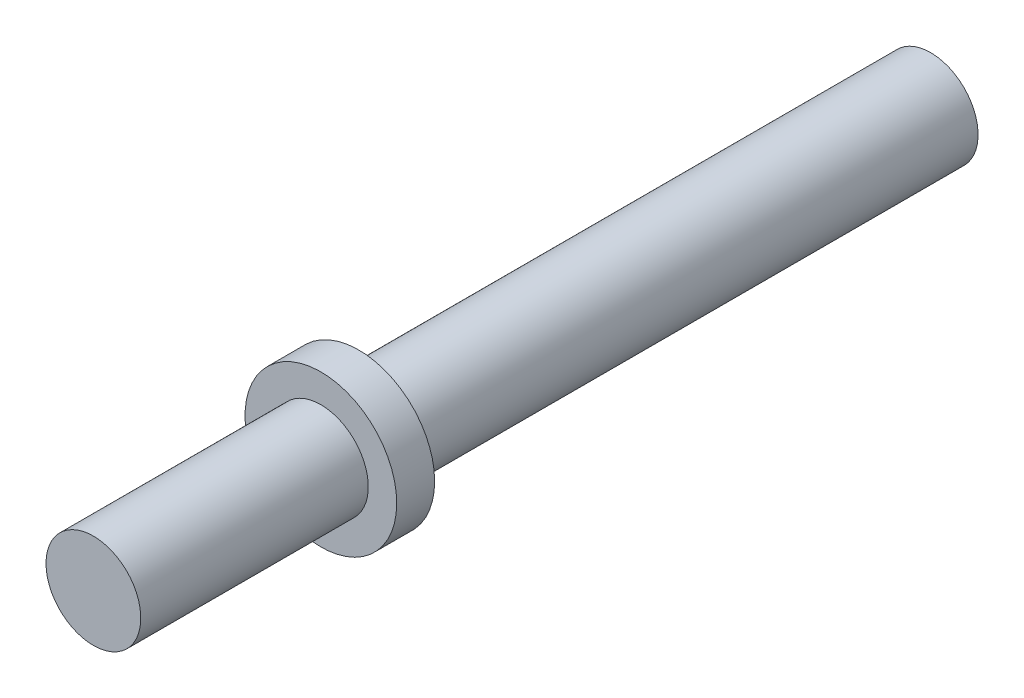
ISO-10303-21;
HEADER;
FILE_DESCRIPTION(('STEP AP214'),'2;1');
FILE_NAME('part.step','',(''),(''),'','','');
FILE_SCHEMA(('AUTOMOTIVE_DESIGN { 1 0 10303 214 1 1 1 1 }'));
ENDSEC;
DATA;
#1=APPLICATION_CONTEXT('core data for automotive mechanical design processes');
#2=APPLICATION_PROTOCOL_DEFINITION('international standard','automotive_design',2000,#1);
#3=PRODUCT_CONTEXT('',#1,'mechanical');
#4=PRODUCT('Part','Part','',(#3));
#5=PRODUCT_RELATED_PRODUCT_CATEGORY('part','',(#4));
#6=PRODUCT_DEFINITION_FORMATION('','',#4);
#7=PRODUCT_DEFINITION_CONTEXT('part definition',#1,'design');
#8=PRODUCT_DEFINITION('design','',#6,#7);
#9=PRODUCT_DEFINITION_SHAPE('','',#8);
#10=(LENGTH_UNIT() NAMED_UNIT(*) SI_UNIT(.MILLI.,.METRE.));
#11=(NAMED_UNIT(*) PLANE_ANGLE_UNIT() SI_UNIT($,.RADIAN.));
#12=(NAMED_UNIT(*) SI_UNIT($,.STERADIAN.) SOLID_ANGLE_UNIT());
#13=UNCERTAINTY_MEASURE_WITH_UNIT(LENGTH_MEASURE(1.E-05),#10,'distance_accuracy_value','');
#14=(GEOMETRIC_REPRESENTATION_CONTEXT(3) GLOBAL_UNCERTAINTY_ASSIGNED_CONTEXT((#13)) GLOBAL_UNIT_ASSIGNED_CONTEXT((#10,
#11,#12)) REPRESENTATION_CONTEXT('',''));
#15=CARTESIAN_POINT('',(0.,0.,0.));
#16=DIRECTION('',(0.,0.,1.));
#17=DIRECTION('',(1.,0.,0.));
#18=AXIS2_PLACEMENT_3D('',#15,#16,#17);
#19=CARTESIAN_POINT('',(-32.018684277368,-34.6434023405005,44.));
#20=DIRECTION('',(0.,0.,-1.));
#21=DIRECTION('',(-1.,0.,0.));
#22=AXIS2_PLACEMENT_3D('',#19,#20,#21);
#23=CYLINDRICAL_SURFACE('',#22,1.5);
#24=CARTESIAN_POINT('',(-32.018684277368,-34.6434023405005,36.8));
#25=DIRECTION('',(0.,0.,1.));
#26=DIRECTION('',(1.,0.,0.));
#27=AXIS2_PLACEMENT_3D('',#24,#25,#26);
#28=CIRCLE('',#27,1.5);
#29=CARTESIAN_POINT('',(-33.518684277368,-34.6434023405005,36.8));
#30=VERTEX_POINT('',#29);
#31=EDGE_CURVE('E42',#30,#30,#28,.T.);
#32=CARTESIAN_POINT('',(-32.018684277368,-34.6434023405005,44.));
#33=DIRECTION('',(0.,0.,1.));
#34=DIRECTION('',(1.,0.,0.));
#35=AXIS2_PLACEMENT_3D('',#32,#33,#34);
#36=CIRCLE('',#35,1.5);
#37=CARTESIAN_POINT('',(-33.518684277368,-34.6434023405005,44.));
#38=VERTEX_POINT('',#37);
#39=EDGE_CURVE('E46',#38,#38,#36,.T.);
#40=CARTESIAN_POINT('',(-33.518684277368,-34.6434023405005,36.8));
#41=CARTESIAN_POINT('',(-33.518684277368,-34.6434023405005,36.875));
#42=CARTESIAN_POINT('',(-33.518684277368,-34.6434023405005,36.95));
#43=CARTESIAN_POINT('',(-33.518684277368,-34.6434023405005,37.1));
#44=CARTESIAN_POINT('',(-33.518684277368,-34.6434023405005,37.175));
#45=CARTESIAN_POINT('',(-33.518684277368,-34.6434023405005,37.325));
#46=CARTESIAN_POINT('',(-33.518684277368,-34.6434023405005,37.4));
#47=CARTESIAN_POINT('',(-33.518684277368,-34.6434023405005,37.55));
#48=CARTESIAN_POINT('',(-33.518684277368,-34.6434023405005,37.625));
#49=CARTESIAN_POINT('',(-33.518684277368,-34.6434023405005,37.775));
#50=CARTESIAN_POINT('',(-33.518684277368,-34.6434023405005,37.85));
#51=CARTESIAN_POINT('',(-33.518684277368,-34.6434023405005,38.));
#52=CARTESIAN_POINT('',(-33.518684277368,-34.6434023405005,38.075));
#53=CARTESIAN_POINT('',(-33.518684277368,-34.6434023405005,38.225));
#54=CARTESIAN_POINT('',(-33.518684277368,-34.6434023405005,38.3));
#55=CARTESIAN_POINT('',(-33.518684277368,-34.6434023405005,38.45));
#56=CARTESIAN_POINT('',(-33.518684277368,-34.6434023405005,38.525));
#57=CARTESIAN_POINT('',(-33.518684277368,-34.6434023405005,38.675));
#58=CARTESIAN_POINT('',(-33.518684277368,-34.6434023405005,38.75));
#59=CARTESIAN_POINT('',(-33.518684277368,-34.6434023405005,38.9));
#60=CARTESIAN_POINT('',(-33.518684277368,-34.6434023405005,38.975));
#61=CARTESIAN_POINT('',(-33.518684277368,-34.6434023405005,39.125));
#62=CARTESIAN_POINT('',(-33.518684277368,-34.6434023405005,39.2));
#63=CARTESIAN_POINT('',(-33.518684277368,-34.6434023405005,39.35));
#64=CARTESIAN_POINT('',(-33.518684277368,-34.6434023405005,39.425));
#65=CARTESIAN_POINT('',(-33.518684277368,-34.6434023405005,39.575));
#66=CARTESIAN_POINT('',(-33.518684277368,-34.6434023405005,39.65));
#67=CARTESIAN_POINT('',(-33.518684277368,-34.6434023405005,39.8));
#68=CARTESIAN_POINT('',(-33.518684277368,-34.6434023405005,39.875));
#69=CARTESIAN_POINT('',(-33.518684277368,-34.6434023405005,40.025));
#70=CARTESIAN_POINT('',(-33.518684277368,-34.6434023405005,40.1));
#71=CARTESIAN_POINT('',(-33.518684277368,-34.6434023405005,40.25));
#72=CARTESIAN_POINT('',(-33.518684277368,-34.6434023405005,40.325));
#73=CARTESIAN_POINT('',(-33.518684277368,-34.6434023405005,40.475));
#74=CARTESIAN_POINT('',(-33.518684277368,-34.6434023405005,40.55));
#75=CARTESIAN_POINT('',(-33.518684277368,-34.6434023405005,40.7));
#76=CARTESIAN_POINT('',(-33.518684277368,-34.6434023405005,40.775));
#77=CARTESIAN_POINT('',(-33.518684277368,-34.6434023405005,40.925));
#78=CARTESIAN_POINT('',(-33.518684277368,-34.6434023405005,41.));
#79=CARTESIAN_POINT('',(-33.518684277368,-34.6434023405005,41.15));
#80=CARTESIAN_POINT('',(-33.518684277368,-34.6434023405005,41.225));
#81=CARTESIAN_POINT('',(-33.518684277368,-34.6434023405005,41.375));
#82=CARTESIAN_POINT('',(-33.518684277368,-34.6434023405005,41.45));
#83=CARTESIAN_POINT('',(-33.518684277368,-34.6434023405005,41.6));
#84=CARTESIAN_POINT('',(-33.518684277368,-34.6434023405005,41.675));
#85=CARTESIAN_POINT('',(-33.518684277368,-34.6434023405005,41.825));
#86=CARTESIAN_POINT('',(-33.518684277368,-34.6434023405005,41.9));
#87=CARTESIAN_POINT('',(-33.518684277368,-34.6434023405005,42.05));
#88=CARTESIAN_POINT('',(-33.518684277368,-34.6434023405005,42.125));
#89=CARTESIAN_POINT('',(-33.518684277368,-34.6434023405005,42.275));
#90=CARTESIAN_POINT('',(-33.518684277368,-34.6434023405005,42.35));
#91=CARTESIAN_POINT('',(-33.518684277368,-34.6434023405005,42.5));
#92=CARTESIAN_POINT('',(-33.518684277368,-34.6434023405005,42.575));
#93=CARTESIAN_POINT('',(-33.518684277368,-34.6434023405005,42.725));
#94=CARTESIAN_POINT('',(-33.518684277368,-34.6434023405005,42.8));
#95=CARTESIAN_POINT('',(-33.518684277368,-34.6434023405005,42.95));
#96=CARTESIAN_POINT('',(-33.518684277368,-34.6434023405005,43.025));
#97=CARTESIAN_POINT('',(-33.518684277368,-34.6434023405005,43.175));
#98=CARTESIAN_POINT('',(-33.518684277368,-34.6434023405005,43.25));
#99=CARTESIAN_POINT('',(-33.518684277368,-34.6434023405005,43.4));
#100=CARTESIAN_POINT('',(-33.518684277368,-34.6434023405005,43.475));
#101=CARTESIAN_POINT('',(-33.518684277368,-34.6434023405005,43.625));
#102=CARTESIAN_POINT('',(-33.518684277368,-34.6434023405005,43.7));
#103=CARTESIAN_POINT('',(-33.518684277368,-34.6434023405005,43.85));
#104=CARTESIAN_POINT('',(-33.518684277368,-34.6434023405005,43.925));
#105=CARTESIAN_POINT('',(-33.518684277368,-34.6434023405005,44.));
#106=B_SPLINE_CURVE_WITH_KNOTS('',3,(#40,#41,#42,#43,#44,#45,#46,#47,#48,#49,#50,#51,#52,#53,
#54,#55,#56,#57,#58,#59,#60,#61,#62,#63,#64,#65,#66,#67,#68,#69,#70,#71,#72,#73,#74,#75,#76,#77,
#78,#79,#80,#81,#82,#83,#84,#85,#86,#87,#88,#89,#90,#91,#92,#93,#94,#95,#96,#97,#98,#99,#100,
#101,#102,#103,#104,#105),.UNSPECIFIED.,.F.,.F.,(4,2,2,2,2,2,2,2,2,2,2,2,2,2,2,2,2,2,2,2,2,2,2,
2,2,2,2,2,2,2,2,2,4),(0.,0.225000000000003,0.449999999999999,0.675000000000002,
0.900000000000005,1.125,1.35,1.575,1.8,2.02500000000001,2.25,2.475,2.7,2.925,3.15,3.375,3.6,
3.825,4.05000000000001,4.275,4.5,4.725,4.95,5.175,5.4,5.62500000000001,5.85,6.075,6.3,6.525,
6.75,6.975,7.2),.UNSPECIFIED.);
#107=EDGE_CURVE('BSEAM39',#30,#38,#106,.T.);
#108=ORIENTED_EDGE('',*,*,#31,.T.);
#109=ORIENTED_EDGE('',*,*,#39,.F.);
#110=ORIENTED_EDGE('',*,*,#107,.T.);
#111=ORIENTED_EDGE('',*,*,#107,.F.);
#112=EDGE_LOOP('',(#108,#110,#109,#111));
#113=FACE_BOUND('',#112,.T.);
#114=ADVANCED_FACE('F39',(#113),#23,.T.);
#115=CARTESIAN_POINT('',(-32.018684277368,-34.6434023405005,44.));
#116=DIRECTION('',(0.,0.,1.));
#117=DIRECTION('',(1.,0.,0.));
#118=AXIS2_PLACEMENT_3D('',#115,#116,#117);
#119=PLANE('',#118);
#120=ORIENTED_EDGE('',*,*,#39,.T.);
#121=EDGE_LOOP('',(#120));
#122=FACE_BOUND('',#121,.T.);
#123=ADVANCED_FACE('F78',(#122),#119,.T.);
#124=CARTESIAN_POINT('',(-32.018684277368,-34.6434023405005,36.8));
#125=DIRECTION('',(0.,0.,-1.));
#126=DIRECTION('',(-1.,0.,0.));
#127=AXIS2_PLACEMENT_3D('',#124,#125,#126);
#128=CYLINDRICAL_SURFACE('',#127,2.4);
#129=CARTESIAN_POINT('',(-32.018684277368,-34.6434023405005,36.8));
#130=DIRECTION('',(0.,0.,1.));
#131=DIRECTION('',(1.,0.,0.));
#132=AXIS2_PLACEMENT_3D('',#129,#130,#131);
#133=CIRCLE('',#132,2.4);
#134=CARTESIAN_POINT('',(-29.618684277368,-34.6434023405005,36.8));
#135=VERTEX_POINT('',#134);
#136=EDGE_CURVE('E58',#135,#135,#133,.T.);
#137=ORIENTED_EDGE('',*,*,#136,.F.);
#138=EDGE_LOOP('',(#137));
#139=FACE_BOUND('',#138,.T.);
#140=CARTESIAN_POINT('',(-32.018684277368,-34.6434023405005,35.6));
#141=DIRECTION('',(0.,0.,1.));
#142=DIRECTION('',(1.,0.,0.));
#143=AXIS2_PLACEMENT_3D('',#140,#141,#142);
#144=CIRCLE('',#143,2.4);
#145=CARTESIAN_POINT('',(-29.618684277368,-34.6434023405005,35.6));
#146=VERTEX_POINT('',#145);
#147=EDGE_CURVE('E55',#146,#146,#144,.T.);
#148=ORIENTED_EDGE('',*,*,#147,.T.);
#149=EDGE_LOOP('',(#148));
#150=FACE_BOUND('',#149,.T.);
#151=ADVANCED_FACE('F70',(#139,#150),#128,.T.);
#152=CARTESIAN_POINT('',(-32.018684277368,-34.6434023405005,36.8));
#153=DIRECTION('',(0.,0.,1.));
#154=DIRECTION('',(1.,0.,0.));
#155=AXIS2_PLACEMENT_3D('',#152,#153,#154);
#156=PLANE('',#155);
#157=ORIENTED_EDGE('',*,*,#31,.F.);
#158=EDGE_LOOP('',(#157));
#159=FACE_BOUND('',#158,.T.);
#160=ORIENTED_EDGE('',*,*,#136,.T.);
#161=EDGE_LOOP('',(#160));
#162=FACE_BOUND('',#161,.T.);
#163=ADVANCED_FACE('F67',(#159,#162),#156,.T.);
#164=CARTESIAN_POINT('',(-32.018684277368,-34.6434023405005,35.6));
#165=DIRECTION('',(0.,0.,1.));
#166=DIRECTION('',(1.,0.,0.));
#167=AXIS2_PLACEMENT_3D('',#164,#165,#166);
#168=PLANE('',#167);
#169=CARTESIAN_POINT('',(-32.018684277368,-34.6434023405005,35.6));
#170=DIRECTION('',(0.,0.,1.));
#171=DIRECTION('',(1.,0.,0.));
#172=AXIS2_PLACEMENT_3D('',#169,#170,#171);
#173=CIRCLE('',#172,1.5);
#174=CARTESIAN_POINT('',(-33.518684277368,-34.6434023405005,35.6));
#175=VERTEX_POINT('',#174);
#176=EDGE_CURVE('E10',#175,#175,#173,.T.);
#177=ORIENTED_EDGE('',*,*,#176,.T.);
#178=EDGE_LOOP('',(#177));
#179=FACE_BOUND('',#178,.T.);
#180=ORIENTED_EDGE('',*,*,#147,.F.);
#181=EDGE_LOOP('',(#180));
#182=FACE_BOUND('',#181,.T.);
#183=ADVANCED_FACE('F69',(#179,#182),#168,.F.);
#184=CARTESIAN_POINT('',(-32.018684277368,-34.6434023405005,17.500063));
#185=DIRECTION('',(0.,0.,1.));
#186=DIRECTION('',(1.,0.,0.));
#187=AXIS2_PLACEMENT_3D('',#184,#185,#186);
#188=PLANE('',#187);
#189=CARTESIAN_POINT('',(-32.018684277368,-34.6434023405005,17.500063));
#190=DIRECTION('',(0.,0.,1.));
#191=DIRECTION('',(1.,0.,0.));
#192=AXIS2_PLACEMENT_3D('',#189,#190,#191);
#193=CIRCLE('',#192,1.5);
#194=CARTESIAN_POINT('',(-33.518684277368,-34.6434023405005,17.500063));
#195=VERTEX_POINT('',#194);
#196=EDGE_CURVE('E50',#195,#195,#193,.T.);
#197=ORIENTED_EDGE('',*,*,#196,.F.);
#198=EDGE_LOOP('',(#197));
#199=FACE_BOUND('',#198,.T.);
#200=ADVANCED_FACE('F76',(#199),#188,.F.);
#201=CARTESIAN_POINT('',(-33.518684277368,-34.6434023405005,17.500063));
#202=CARTESIAN_POINT('',(-33.518684277368,-34.6434023405005,17.6886040104167));
#203=CARTESIAN_POINT('',(-33.518684277368,-34.6434023405005,17.8771450208333));
#204=CARTESIAN_POINT('',(-33.518684277368,-34.6434023405005,18.2542270416667));
#205=CARTESIAN_POINT('',(-33.518684277368,-34.6434023405005,18.4427680520833));
#206=CARTESIAN_POINT('',(-33.518684277368,-34.6434023405005,18.8198500729167));
#207=CARTESIAN_POINT('',(-33.518684277368,-34.6434023405005,19.0083910833333));
#208=CARTESIAN_POINT('',(-33.518684277368,-34.6434023405005,19.3854731041667));
#209=CARTESIAN_POINT('',(-33.518684277368,-34.6434023405005,19.5740141145833));
#210=CARTESIAN_POINT('',(-33.518684277368,-34.6434023405005,19.9510961354167));
#211=CARTESIAN_POINT('',(-33.518684277368,-34.6434023405005,20.1396371458333));
#212=CARTESIAN_POINT('',(-33.518684277368,-34.6434023405005,20.5167191666667));
#213=CARTESIAN_POINT('',(-33.518684277368,-34.6434023405005,20.7052601770833));
#214=CARTESIAN_POINT('',(-33.518684277368,-34.6434023405005,21.0823421979167));
#215=CARTESIAN_POINT('',(-33.518684277368,-34.6434023405005,21.2708832083333));
#216=CARTESIAN_POINT('',(-33.518684277368,-34.6434023405005,21.6479652291667));
#217=CARTESIAN_POINT('',(-33.518684277368,-34.6434023405005,21.8365062395833));
#218=CARTESIAN_POINT('',(-33.518684277368,-34.6434023405005,22.2135882604167));
#219=CARTESIAN_POINT('',(-33.518684277368,-34.6434023405005,22.4021292708333));
#220=CARTESIAN_POINT('',(-33.518684277368,-34.6434023405005,22.7792112916667));
#221=CARTESIAN_POINT('',(-33.518684277368,-34.6434023405005,22.9677523020833));
#222=CARTESIAN_POINT('',(-33.518684277368,-34.6434023405005,23.3448343229167));
#223=CARTESIAN_POINT('',(-33.518684277368,-34.6434023405005,23.5333753333333));
#224=CARTESIAN_POINT('',(-33.518684277368,-34.6434023405005,23.9104573541667));
#225=CARTESIAN_POINT('',(-33.518684277368,-34.6434023405005,24.0989983645833));
#226=CARTESIAN_POINT('',(-33.518684277368,-34.6434023405005,24.4760803854167));
#227=CARTESIAN_POINT('',(-33.518684277368,-34.6434023405005,24.6646213958333));
#228=CARTESIAN_POINT('',(-33.518684277368,-34.6434023405005,25.0417034166667));
#229=CARTESIAN_POINT('',(-33.518684277368,-34.6434023405005,25.2302444270833));
#230=CARTESIAN_POINT('',(-33.518684277368,-34.6434023405005,25.6073264479167));
#231=CARTESIAN_POINT('',(-33.518684277368,-34.6434023405005,25.7958674583333));
#232=CARTESIAN_POINT('',(-33.518684277368,-34.6434023405005,26.1729494791667));
#233=CARTESIAN_POINT('',(-33.518684277368,-34.6434023405005,26.3614904895833));
#234=CARTESIAN_POINT('',(-33.518684277368,-34.6434023405005,26.7385725104167));
#235=CARTESIAN_POINT('',(-33.518684277368,-34.6434023405005,26.9271135208333));
#236=CARTESIAN_POINT('',(-33.518684277368,-34.6434023405005,27.3041955416667));
#237=CARTESIAN_POINT('',(-33.518684277368,-34.6434023405005,27.4927365520833));
#238=CARTESIAN_POINT('',(-33.518684277368,-34.6434023405005,27.8698185729167));
#239=CARTESIAN_POINT('',(-33.518684277368,-34.6434023405005,28.0583595833333));
#240=CARTESIAN_POINT('',(-33.518684277368,-34.6434023405005,28.4354416041667));
#241=CARTESIAN_POINT('',(-33.518684277368,-34.6434023405005,28.6239826145833));
#242=CARTESIAN_POINT('',(-33.518684277368,-34.6434023405005,29.0010646354167));
#243=CARTESIAN_POINT('',(-33.518684277368,-34.6434023405005,29.1896056458333));
#244=CARTESIAN_POINT('',(-33.518684277368,-34.6434023405005,29.5666876666667));
#245=CARTESIAN_POINT('',(-33.518684277368,-34.6434023405005,29.7552286770833));
#246=CARTESIAN_POINT('',(-33.518684277368,-34.6434023405005,30.1323106979167));
#247=CARTESIAN_POINT('',(-33.518684277368,-34.6434023405005,30.3208517083333));
#248=CARTESIAN_POINT('',(-33.518684277368,-34.6434023405005,30.6979337291667));
#249=CARTESIAN_POINT('',(-33.518684277368,-34.6434023405005,30.8864747395833));
#250=CARTESIAN_POINT('',(-33.518684277368,-34.6434023405005,31.2635567604167));
#251=CARTESIAN_POINT('',(-33.518684277368,-34.6434023405005,31.4520977708333));
#252=CARTESIAN_POINT('',(-33.518684277368,-34.6434023405005,31.8291797916667));
#253=CARTESIAN_POINT('',(-33.518684277368,-34.6434023405005,32.0177208020833));
#254=CARTESIAN_POINT('',(-33.518684277368,-34.6434023405005,32.3948028229167));
#255=CARTESIAN_POINT('',(-33.518684277368,-34.6434023405005,32.5833438333333));
#256=CARTESIAN_POINT('',(-33.518684277368,-34.6434023405005,32.9604258541667));
#257=CARTESIAN_POINT('',(-33.518684277368,-34.6434023405005,33.1489668645833));
#258=CARTESIAN_POINT('',(-33.518684277368,-34.6434023405005,33.5260488854167));
#259=CARTESIAN_POINT('',(-33.518684277368,-34.6434023405005,33.7145898958333));
#260=CARTESIAN_POINT('',(-33.518684277368,-34.6434023405005,34.0916719166667));
#261=CARTESIAN_POINT('',(-33.518684277368,-34.6434023405005,34.2802129270833));
#262=CARTESIAN_POINT('',(-33.518684277368,-34.6434023405005,34.6572949479167));
#263=CARTESIAN_POINT('',(-33.518684277368,-34.6434023405005,34.8458359583333));
#264=CARTESIAN_POINT('',(-33.518684277368,-34.6434023405005,35.2229179791667));
#265=CARTESIAN_POINT('',(-33.518684277368,-34.6434023405005,35.4114589895833));
#266=CARTESIAN_POINT('',(-33.518684277368,-34.6434023405005,35.6));
#267=B_SPLINE_CURVE_WITH_KNOTS('',3,(#201,#202,#203,#204,#205,#206,#207,#208,#209,#210,#211,
#212,#213,#214,#215,#216,#217,#218,#219,#220,#221,#222,#223,#224,#225,#226,#227,#228,#229,#230,
#231,#232,#233,#234,#235,#236,#237,#238,#239,#240,#241,#242,#243,#244,#245,#246,#247,#248,#249,
#250,#251,#252,#253,#254,#255,#256,#257,#258,#259,#260,#261,#262,#263,#264,#265,#266),
.UNSPECIFIED.,.F.,.F.,(4,2,2,2,2,2,2,2,2,2,2,2,2,2,2,2,2,2,2,2,2,2,2,2,2,2,2,2,2,2,2,2,4),(0.,
0.56562303125,1.1312460625,1.69686909375,2.262492125,2.82811515625,3.3937381875,3.95936121875,
4.52498425,5.09060728125,5.6562303125,6.22185334375,6.787476375,7.35309940625,7.9187224375,
8.48434546875,9.0499685,9.61559153125,10.1812145625,10.74683759375,11.312460625,11.87808365625,
12.4437066875,13.00932971875,13.57495275,14.14057578125,14.7061988125,15.27182184375,
15.837444875,16.40306790625,16.9686909375,17.53431396875,18.099937),.UNSPECIFIED.);
#268=EDGE_CURVE('BSEAM82',#195,#175,#267,.T.);
#269=ORIENTED_EDGE('',*,*,#196,.T.);
#270=ORIENTED_EDGE('',*,*,#176,.F.);
#271=ORIENTED_EDGE('',*,*,#268,.T.);
#272=ORIENTED_EDGE('',*,*,#268,.F.);
#273=EDGE_LOOP('',(#269,#271,#270,#272));
#274=FACE_BOUND('',#273,.T.);
#275=ADVANCED_FACE('F82',(#274),#23,.T.);
#276=CLOSED_SHELL('',(#114,#123,#151,#163,#183,#200,#275));
#277=MANIFOLD_SOLID_BREP('B2',#276);
#278=ADVANCED_BREP_SHAPE_REPRESENTATION('',(#18,#277),#14);
#279=SHAPE_DEFINITION_REPRESENTATION(#9,#278);
ENDSEC;
END-ISO-10303-21;
